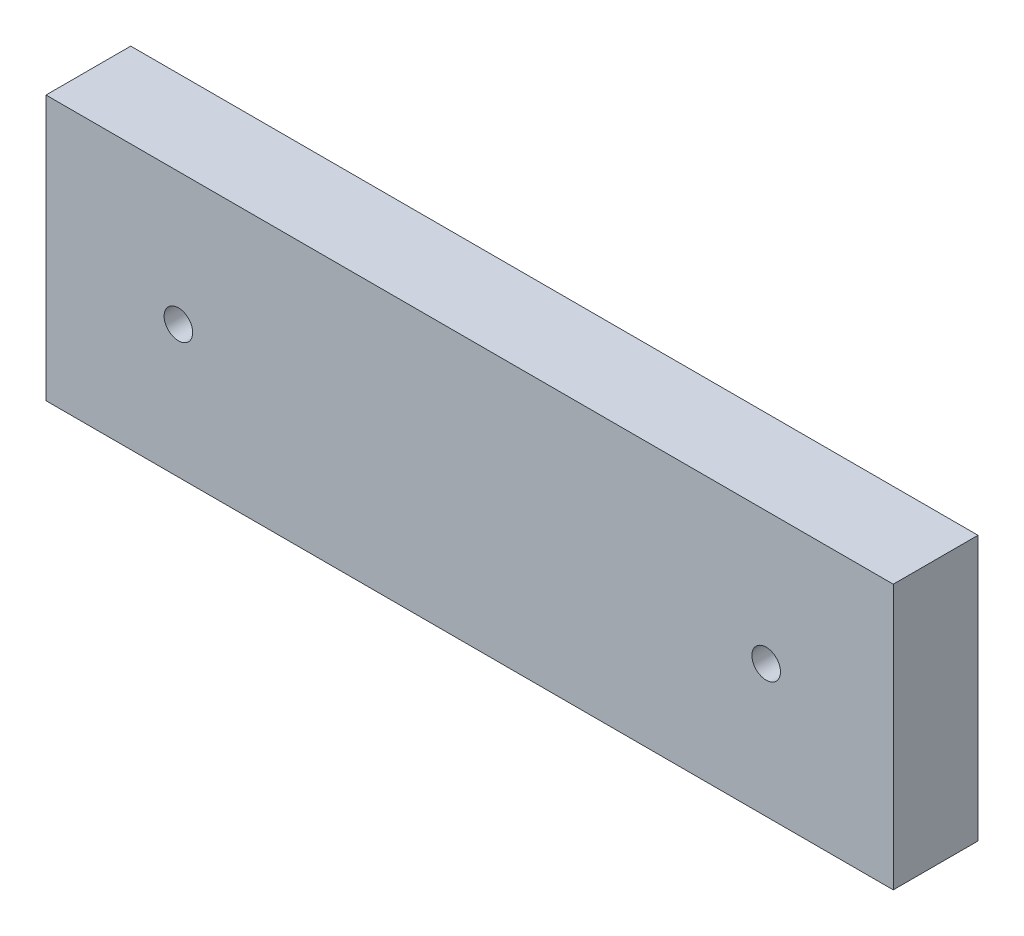
ISO-10303-21;
HEADER;
FILE_DESCRIPTION(('STEP AP214'),'2;1');
FILE_NAME('part.step','',(''),(''),'','','');
FILE_SCHEMA(('AUTOMOTIVE_DESIGN { 1 0 10303 214 1 1 1 1 }'));
ENDSEC;
DATA;
#1=APPLICATION_CONTEXT('core data for automotive mechanical design processes');
#2=APPLICATION_PROTOCOL_DEFINITION('international standard','automotive_design',2000,#1);
#3=PRODUCT_CONTEXT('',#1,'mechanical');
#4=PRODUCT('Part','Part','',(#3));
#5=PRODUCT_RELATED_PRODUCT_CATEGORY('part','',(#4));
#6=PRODUCT_DEFINITION_FORMATION('','',#4);
#7=PRODUCT_DEFINITION_CONTEXT('part definition',#1,'design');
#8=PRODUCT_DEFINITION('design','',#6,#7);
#9=PRODUCT_DEFINITION_SHAPE('','',#8);
#10=(LENGTH_UNIT() NAMED_UNIT(*) SI_UNIT(.MILLI.,.METRE.));
#11=(NAMED_UNIT(*) PLANE_ANGLE_UNIT() SI_UNIT($,.RADIAN.));
#12=(NAMED_UNIT(*) SI_UNIT($,.STERADIAN.) SOLID_ANGLE_UNIT());
#13=UNCERTAINTY_MEASURE_WITH_UNIT(LENGTH_MEASURE(1.E-05),#10,'distance_accuracy_value','');
#14=(GEOMETRIC_REPRESENTATION_CONTEXT(3) GLOBAL_UNCERTAINTY_ASSIGNED_CONTEXT((#13)) GLOBAL_UNIT_ASSIGNED_CONTEXT((#10,
#11,#12)) REPRESENTATION_CONTEXT('',''));
#15=CARTESIAN_POINT('',(0.,0.,0.));
#16=DIRECTION('',(0.,0.,1.));
#17=DIRECTION('',(1.,0.,0.));
#18=AXIS2_PLACEMENT_3D('',#15,#16,#17);
#19=CARTESIAN_POINT('',(68.,-14.15,-1.7));
#20=DIRECTION('',(0.,1.,0.));
#21=DIRECTION('',(-1.,0.,0.));
#22=AXIS2_PLACEMENT_3D('',#19,#20,#21);
#23=PLANE('',#22);
#24=DIRECTION('',(-1.,0.,0.));
#25=VECTOR('',#24,1.);
#26=CARTESIAN_POINT('',(68.,-14.15,-1.7));
#27=LINE('',#26,#25);
#28=CARTESIAN_POINT('',(39.1,-14.15,-1.7));
#29=VERTEX_POINT('',#28);
#30=CARTESIAN_POINT('',(12.5,-14.15,-1.7));
#31=VERTEX_POINT('',#30);
#32=EDGE_CURVE('E144',#29,#31,#27,.T.);
#33=ORIENTED_EDGE('',*,*,#32,.F.);
#34=DIRECTION('',(0.,0.,-1.));
#35=VECTOR('',#34,1.);
#36=CARTESIAN_POINT('',(39.1,-14.15,0.));
#37=LINE('',#36,#35);
#38=CARTESIAN_POINT('',(39.1,-14.15,0.));
#39=VERTEX_POINT('',#38);
#40=EDGE_CURVE('E128',#39,#29,#37,.T.);
#41=ORIENTED_EDGE('',*,*,#40,.F.);
#42=DIRECTION('',(-1.,0.,0.));
#43=VECTOR('',#42,1.);
#44=CARTESIAN_POINT('',(68.,-14.15,0.));
#45=LINE('',#44,#43);
#46=CARTESIAN_POINT('',(12.5,-14.15,0.));
#47=VERTEX_POINT('',#46);
#48=EDGE_CURVE('E174',#39,#47,#45,.T.);
#49=ORIENTED_EDGE('',*,*,#48,.T.);
#50=DIRECTION('',(0.,0.,1.));
#51=VECTOR('',#50,1.);
#52=CARTESIAN_POINT('',(12.5,-14.15,-1.7));
#53=LINE('',#52,#51);
#54=EDGE_CURVE('E149',#31,#47,#53,.T.);
#55=ORIENTED_EDGE('',*,*,#54,.F.);
#56=EDGE_LOOP('',(#33,#41,#49,#55));
#57=FACE_BOUND('',#56,.T.);
#58=ADVANCED_FACE('F39',(#57),#23,.F.);
#59=CARTESIAN_POINT('',(68.,-10.85,-1.7));
#60=DIRECTION('',(0.,-1.,0.));
#61=DIRECTION('',(1.,0.,0.));
#62=AXIS2_PLACEMENT_3D('',#59,#60,#61);
#63=PLANE('',#62);
#64=DIRECTION('',(1.,0.,0.));
#65=VECTOR('',#64,1.);
#66=CARTESIAN_POINT('',(68.,-10.85,0.));
#67=LINE('',#66,#65);
#68=CARTESIAN_POINT('',(12.5,-10.85,0.));
#69=VERTEX_POINT('',#68);
#70=CARTESIAN_POINT('',(39.1,-10.85,0.));
#71=VERTEX_POINT('',#70);
#72=EDGE_CURVE('E160',#69,#71,#67,.T.);
#73=ORIENTED_EDGE('',*,*,#72,.T.);
#74=DIRECTION('',(0.,0.,-1.));
#75=VECTOR('',#74,1.);
#76=CARTESIAN_POINT('',(39.1,-10.85,-1.7));
#77=LINE('',#76,#75);
#78=CARTESIAN_POINT('',(39.1,-10.85,-1.7));
#79=VERTEX_POINT('',#78);
#80=EDGE_CURVE('E175',#71,#79,#77,.T.);
#81=ORIENTED_EDGE('',*,*,#80,.T.);
#82=DIRECTION('',(1.,0.,0.));
#83=VECTOR('',#82,1.);
#84=CARTESIAN_POINT('',(68.,-10.85,-1.7));
#85=LINE('',#84,#83);
#86=CARTESIAN_POINT('',(12.5,-10.85,-1.7));
#87=VERTEX_POINT('',#86);
#88=EDGE_CURVE('E147',#87,#79,#85,.T.);
#89=ORIENTED_EDGE('',*,*,#88,.F.);
#90=DIRECTION('',(0.,0.,1.));
#91=VECTOR('',#90,1.);
#92=CARTESIAN_POINT('',(12.5,-10.85,-1.7));
#93=LINE('',#92,#91);
#94=EDGE_CURVE('E189',#87,#69,#93,.T.);
#95=ORIENTED_EDGE('',*,*,#94,.T.);
#96=EDGE_LOOP('',(#73,#81,#89,#95));
#97=FACE_BOUND('',#96,.T.);
#98=ADVANCED_FACE('F289',(#97),#63,.F.);
#99=CARTESIAN_POINT('',(68.,-12.5,-1.7));
#100=DIRECTION('',(0.,0.,-1.));
#101=DIRECTION('',(-1.,0.,0.));
#102=AXIS2_PLACEMENT_3D('',#99,#100,#101);
#103=PLANE('',#102);
#104=CARTESIAN_POINT('',(12.5,-12.5,-1.7));
#105=DIRECTION('',(0.,0.,-1.));
#106=DIRECTION('',(-1.,0.,0.));
#107=AXIS2_PLACEMENT_3D('',#104,#105,#106);
#108=CIRCLE('',#107,1.35);
#109=CARTESIAN_POINT('',(11.15,-12.5,-1.7));
#110=VERTEX_POINT('',#109);
#111=EDGE_CURVE('E280',#110,#110,#108,.T.);
#112=ORIENTED_EDGE('',*,*,#111,.F.);
#113=EDGE_LOOP('',(#112));
#114=FACE_BOUND('',#113,.T.);
#115=DIRECTION('',(0.,1.,0.));
#116=VECTOR('',#115,1.);
#117=CARTESIAN_POINT('',(39.1,-12.5,-1.7));
#118=LINE('',#117,#116);
#119=EDGE_CURVE('E11',#29,#79,#118,.T.);
#120=ORIENTED_EDGE('',*,*,#119,.F.);
#121=ORIENTED_EDGE('',*,*,#32,.T.);
#122=CARTESIAN_POINT('',(12.5,-12.5,-1.7));
#123=DIRECTION('',(0.,0.,-1.));
#124=DIRECTION('',(-1.,0.,0.));
#125=AXIS2_PLACEMENT_3D('',#122,#123,#124);
#126=CIRCLE('',#125,1.65);
#127=EDGE_CURVE('E158',#31,#87,#126,.T.);
#128=ORIENTED_EDGE('',*,*,#127,.T.);
#129=ORIENTED_EDGE('',*,*,#88,.T.);
#130=EDGE_LOOP('',(#120,#121,#128,#129));
#131=FACE_BOUND('',#130,.T.);
#132=ADVANCED_FACE('F143',(#114,#131),#103,.T.);
#133=CARTESIAN_POINT('',(0.,0.,0.));
#134=DIRECTION('',(0.,0.,1.));
#135=DIRECTION('',(1.,0.,0.));
#136=AXIS2_PLACEMENT_3D('',#133,#134,#135);
#137=PLANE('',#136);
#138=DIRECTION('',(0.,-1.,0.));
#139=VECTOR('',#138,1.);
#140=CARTESIAN_POINT('',(39.1,-7.15,0.));
#141=LINE('',#140,#139);
#142=EDGE_CURVE('E133',#71,#39,#141,.T.);
#143=ORIENTED_EDGE('',*,*,#142,.F.);
#144=ORIENTED_EDGE('',*,*,#72,.F.);
#145=CARTESIAN_POINT('',(12.5,-12.5,0.));
#146=DIRECTION('',(0.,0.,-1.));
#147=DIRECTION('',(-1.,0.,0.));
#148=AXIS2_PLACEMENT_3D('',#145,#146,#147);
#149=CIRCLE('',#148,1.65);
#150=EDGE_CURVE('E178',#47,#69,#149,.T.);
#151=ORIENTED_EDGE('',*,*,#150,.F.);
#152=ORIENTED_EDGE('',*,*,#48,.F.);
#153=EDGE_LOOP('',(#143,#144,#151,#152));
#154=FACE_BOUND('',#153,.T.);
#155=CARTESIAN_POINT('',(41.3,-10.85,0.));
#156=VERTEX_POINT('',#155);
#157=CARTESIAN_POINT('',(68.,-10.85,0.));
#158=VERTEX_POINT('',#157);
#159=EDGE_CURVE('E182',#156,#158,#67,.T.);
#160=ORIENTED_EDGE('',*,*,#159,.F.);
#161=DIRECTION('',(0.,-1.,0.));
#162=VECTOR('',#161,1.);
#163=CARTESIAN_POINT('',(41.3,-7.15,0.));
#164=LINE('',#163,#162);
#165=CARTESIAN_POINT('',(41.3,-14.15,0.));
#166=VERTEX_POINT('',#165);
#167=EDGE_CURVE('E248',#156,#166,#164,.T.);
#168=ORIENTED_EDGE('',*,*,#167,.T.);
#169=CARTESIAN_POINT('',(68.,-14.15,0.));
#170=VERTEX_POINT('',#169);
#171=EDGE_CURVE('E63',#170,#166,#45,.T.);
#172=ORIENTED_EDGE('',*,*,#171,.F.);
#173=CARTESIAN_POINT('',(68.,-12.5,0.));
#174=DIRECTION('',(0.,0.,-1.));
#175=DIRECTION('',(-1.,0.,0.));
#176=AXIS2_PLACEMENT_3D('',#173,#174,#175);
#177=CIRCLE('',#176,1.65);
#178=EDGE_CURVE('E170',#158,#170,#177,.T.);
#179=ORIENTED_EDGE('',*,*,#178,.F.);
#180=EDGE_LOOP('',(#160,#168,#172,#179));
#181=FACE_BOUND('',#180,.T.);
#182=DIRECTION('',(0.,-1.,0.));
#183=VECTOR('',#182,1.);
#184=CARTESIAN_POINT('',(0.,0.,0.));
#185=LINE('',#184,#183);
#186=CARTESIAN_POINT('',(0.,0.,0.));
#187=VERTEX_POINT('',#186);
#188=CARTESIAN_POINT('',(0.,-25.,0.));
#189=VERTEX_POINT('',#188);
#190=EDGE_CURVE('E198',#187,#189,#185,.T.);
#191=ORIENTED_EDGE('',*,*,#190,.F.);
#192=DIRECTION('',(-1.,0.,0.));
#193=VECTOR('',#192,1.);
#194=CARTESIAN_POINT('',(0.,0.,0.));
#195=LINE('',#194,#193);
#196=CARTESIAN_POINT('',(80.,0.,0.));
#197=VERTEX_POINT('',#196);
#198=EDGE_CURVE('E204',#197,#187,#195,.T.);
#199=ORIENTED_EDGE('',*,*,#198,.F.);
#200=DIRECTION('',(0.,1.,0.));
#201=VECTOR('',#200,1.);
#202=CARTESIAN_POINT('',(80.,0.,0.));
#203=LINE('',#202,#201);
#204=CARTESIAN_POINT('',(80.,-25.,0.));
#205=VERTEX_POINT('',#204);
#206=EDGE_CURVE('E220',#205,#197,#203,.T.);
#207=ORIENTED_EDGE('',*,*,#206,.F.);
#208=DIRECTION('',(1.,0.,0.));
#209=VECTOR('',#208,1.);
#210=CARTESIAN_POINT('',(0.,-25.,0.));
#211=LINE('',#210,#209);
#212=EDGE_CURVE('E217',#189,#205,#211,.T.);
#213=ORIENTED_EDGE('',*,*,#212,.F.);
#214=EDGE_LOOP('',(#191,#199,#207,#213));
#215=FACE_BOUND('',#214,.T.);
#216=ADVANCED_FACE('F257',(#154,#181,#215),#137,.F.);
#217=CARTESIAN_POINT('',(0.,0.,8.));
#218=DIRECTION('',(1.,0.,0.));
#219=DIRECTION('',(0.,1.,0.));
#220=AXIS2_PLACEMENT_3D('',#217,#218,#219);
#221=PLANE('',#220);
#222=ORIENTED_EDGE('',*,*,#190,.T.);
#223=DIRECTION('',(0.,0.,-1.));
#224=VECTOR('',#223,1.);
#225=CARTESIAN_POINT('',(0.,-25.,8.));
#226=LINE('',#225,#224);
#227=CARTESIAN_POINT('',(0.,-25.,8.));
#228=VERTEX_POINT('',#227);
#229=EDGE_CURVE('E236',#228,#189,#226,.T.);
#230=ORIENTED_EDGE('',*,*,#229,.F.);
#231=DIRECTION('',(0.,-1.,0.));
#232=VECTOR('',#231,1.);
#233=CARTESIAN_POINT('',(0.,0.,8.));
#234=LINE('',#233,#232);
#235=CARTESIAN_POINT('',(0.,0.,8.));
#236=VERTEX_POINT('',#235);
#237=EDGE_CURVE('E199',#236,#228,#234,.T.);
#238=ORIENTED_EDGE('',*,*,#237,.F.);
#239=DIRECTION('',(0.,0.,-1.));
#240=VECTOR('',#239,1.);
#241=CARTESIAN_POINT('',(0.,0.,8.));
#242=LINE('',#241,#240);
#243=EDGE_CURVE('E213',#236,#187,#242,.T.);
#244=ORIENTED_EDGE('',*,*,#243,.T.);
#245=EDGE_LOOP('',(#222,#230,#238,#244));
#246=FACE_BOUND('',#245,.T.);
#247=ADVANCED_FACE('F41',(#246),#221,.F.);
#248=CARTESIAN_POINT('',(0.,-25.,8.));
#249=DIRECTION('',(0.,1.,0.));
#250=DIRECTION('',(0.,0.,1.));
#251=AXIS2_PLACEMENT_3D('',#248,#249,#250);
#252=PLANE('',#251);
#253=ORIENTED_EDGE('',*,*,#212,.T.);
#254=DIRECTION('',(0.,0.,-1.));
#255=VECTOR('',#254,1.);
#256=CARTESIAN_POINT('',(80.,-25.,8.));
#257=LINE('',#256,#255);
#258=CARTESIAN_POINT('',(80.,-25.,8.));
#259=VERTEX_POINT('',#258);
#260=EDGE_CURVE('E232',#259,#205,#257,.T.);
#261=ORIENTED_EDGE('',*,*,#260,.F.);
#262=DIRECTION('',(1.,0.,0.));
#263=VECTOR('',#262,1.);
#264=CARTESIAN_POINT('',(0.,-25.,8.));
#265=LINE('',#264,#263);
#266=EDGE_CURVE('E203',#228,#259,#265,.T.);
#267=ORIENTED_EDGE('',*,*,#266,.F.);
#268=ORIENTED_EDGE('',*,*,#229,.T.);
#269=EDGE_LOOP('',(#253,#261,#267,#268));
#270=FACE_BOUND('',#269,.T.);
#271=ADVANCED_FACE('F329',(#270),#252,.F.);
#272=CARTESIAN_POINT('',(80.,0.,8.));
#273=DIRECTION('',(-1.,0.,0.));
#274=DIRECTION('',(0.,-1.,0.));
#275=AXIS2_PLACEMENT_3D('',#272,#273,#274);
#276=PLANE('',#275);
#277=ORIENTED_EDGE('',*,*,#206,.T.);
#278=DIRECTION('',(0.,0.,-1.));
#279=VECTOR('',#278,1.);
#280=CARTESIAN_POINT('',(80.,0.,8.));
#281=LINE('',#280,#279);
#282=CARTESIAN_POINT('',(80.,0.,8.));
#283=VERTEX_POINT('',#282);
#284=EDGE_CURVE('E228',#283,#197,#281,.T.);
#285=ORIENTED_EDGE('',*,*,#284,.F.);
#286=DIRECTION('',(0.,1.,0.));
#287=VECTOR('',#286,1.);
#288=CARTESIAN_POINT('',(80.,0.,8.));
#289=LINE('',#288,#287);
#290=EDGE_CURVE('E207',#259,#283,#289,.T.);
#291=ORIENTED_EDGE('',*,*,#290,.F.);
#292=ORIENTED_EDGE('',*,*,#260,.T.);
#293=EDGE_LOOP('',(#277,#285,#291,#292));
#294=FACE_BOUND('',#293,.T.);
#295=ADVANCED_FACE('F326',(#294),#276,.F.);
#296=CARTESIAN_POINT('',(0.,0.,8.));
#297=DIRECTION('',(0.,-1.,0.));
#298=DIRECTION('',(0.,0.,-1.));
#299=AXIS2_PLACEMENT_3D('',#296,#297,#298);
#300=PLANE('',#299);
#301=ORIENTED_EDGE('',*,*,#198,.T.);
#302=ORIENTED_EDGE('',*,*,#243,.F.);
#303=DIRECTION('',(-1.,0.,0.));
#304=VECTOR('',#303,1.);
#305=CARTESIAN_POINT('',(0.,0.,8.));
#306=LINE('',#305,#304);
#307=EDGE_CURVE('E210',#283,#236,#306,.T.);
#308=ORIENTED_EDGE('',*,*,#307,.F.);
#309=ORIENTED_EDGE('',*,*,#284,.T.);
#310=EDGE_LOOP('',(#301,#302,#308,#309));
#311=FACE_BOUND('',#310,.T.);
#312=ADVANCED_FACE('F320',(#311),#300,.F.);
#313=CARTESIAN_POINT('',(0.,0.,8.));
#314=DIRECTION('',(0.,0.,1.));
#315=DIRECTION('',(1.,0.,0.));
#316=AXIS2_PLACEMENT_3D('',#313,#314,#315);
#317=PLANE('',#316);
#318=CARTESIAN_POINT('',(68.,-12.5,8.));
#319=DIRECTION('',(0.,0.,-1.));
#320=DIRECTION('',(-1.,0.,0.));
#321=AXIS2_PLACEMENT_3D('',#318,#319,#320);
#322=CIRCLE('',#321,1.35000000000001);
#323=CARTESIAN_POINT('',(66.65,-12.5,8.));
#324=VERTEX_POINT('',#323);
#325=EDGE_CURVE('E139',#324,#324,#322,.T.);
#326=ORIENTED_EDGE('',*,*,#325,.T.);
#327=EDGE_LOOP('',(#326));
#328=FACE_BOUND('',#327,.T.);
#329=CARTESIAN_POINT('',(12.5,-12.5,8.));
#330=DIRECTION('',(0.,0.,-1.));
#331=DIRECTION('',(-1.,0.,0.));
#332=AXIS2_PLACEMENT_3D('',#329,#330,#331);
#333=CIRCLE('',#332,1.35);
#334=CARTESIAN_POINT('',(11.15,-12.5,8.));
#335=VERTEX_POINT('',#334);
#336=EDGE_CURVE('E276',#335,#335,#333,.T.);
#337=ORIENTED_EDGE('',*,*,#336,.T.);
#338=EDGE_LOOP('',(#337));
#339=FACE_BOUND('',#338,.T.);
#340=ORIENTED_EDGE('',*,*,#237,.T.);
#341=ORIENTED_EDGE('',*,*,#266,.T.);
#342=ORIENTED_EDGE('',*,*,#290,.T.);
#343=ORIENTED_EDGE('',*,*,#307,.T.);
#344=EDGE_LOOP('',(#340,#341,#342,#343));
#345=FACE_BOUND('',#344,.T.);
#346=ADVANCED_FACE('F316',(#328,#339,#345),#317,.T.);
#347=CARTESIAN_POINT('',(68.,-12.5,-1.7));
#348=DIRECTION('',(0.,0.,1.));
#349=DIRECTION('',(1.,0.,0.));
#350=AXIS2_PLACEMENT_3D('',#347,#348,#349);
#351=CYLINDRICAL_SURFACE('',#350,1.65);
#352=ORIENTED_EDGE('',*,*,#178,.T.);
#353=DIRECTION('',(0.,0.,1.));
#354=VECTOR('',#353,1.);
#355=CARTESIAN_POINT('',(68.,-14.15,-1.7));
#356=LINE('',#355,#354);
#357=CARTESIAN_POINT('',(68.,-14.15,-1.7));
#358=VERTEX_POINT('',#357);
#359=EDGE_CURVE('E195',#358,#170,#356,.T.);
#360=ORIENTED_EDGE('',*,*,#359,.F.);
#361=CARTESIAN_POINT('',(68.,-12.5,-1.7));
#362=DIRECTION('',(0.,0.,-1.));
#363=DIRECTION('',(-1.,0.,0.));
#364=AXIS2_PLACEMENT_3D('',#361,#362,#363);
#365=CIRCLE('',#364,1.65);
#366=CARTESIAN_POINT('',(68.,-10.85,-1.7));
#367=VERTEX_POINT('',#366);
#368=EDGE_CURVE('E153',#367,#358,#365,.T.);
#369=ORIENTED_EDGE('',*,*,#368,.F.);
#370=DIRECTION('',(0.,0.,1.));
#371=VECTOR('',#370,1.);
#372=CARTESIAN_POINT('',(68.,-10.85,-1.7));
#373=LINE('',#372,#371);
#374=EDGE_CURVE('E169',#367,#158,#373,.T.);
#375=ORIENTED_EDGE('',*,*,#374,.T.);
#376=EDGE_LOOP('',(#352,#360,#369,#375));
#377=FACE_BOUND('',#376,.T.);
#378=ADVANCED_FACE('F255',(#377),#351,.T.);
#379=ORIENTED_EDGE('',*,*,#171,.T.);
#380=DIRECTION('',(0.,0.,1.));
#381=VECTOR('',#380,1.);
#382=CARTESIAN_POINT('',(41.3,-14.15,0.));
#383=LINE('',#382,#381);
#384=CARTESIAN_POINT('',(41.3,-14.15,-1.7));
#385=VERTEX_POINT('',#384);
#386=EDGE_CURVE('E138',#385,#166,#383,.T.);
#387=ORIENTED_EDGE('',*,*,#386,.F.);
#388=EDGE_CURVE('E152',#358,#385,#27,.T.);
#389=ORIENTED_EDGE('',*,*,#388,.F.);
#390=ORIENTED_EDGE('',*,*,#359,.T.);
#391=EDGE_LOOP('',(#379,#387,#389,#390));
#392=FACE_BOUND('',#391,.T.);
#393=ADVANCED_FACE('F246',(#392),#23,.F.);
#394=CARTESIAN_POINT('',(12.5,-12.5,-1.7));
#395=DIRECTION('',(0.,0.,1.));
#396=DIRECTION('',(1.,0.,0.));
#397=AXIS2_PLACEMENT_3D('',#394,#395,#396);
#398=CYLINDRICAL_SURFACE('',#397,1.65);
#399=ORIENTED_EDGE('',*,*,#150,.T.);
#400=ORIENTED_EDGE('',*,*,#94,.F.);
#401=ORIENTED_EDGE('',*,*,#127,.F.);
#402=ORIENTED_EDGE('',*,*,#54,.T.);
#403=EDGE_LOOP('',(#399,#400,#401,#402));
#404=FACE_BOUND('',#403,.T.);
#405=ADVANCED_FACE('F310',(#404),#398,.T.);
#406=CARTESIAN_POINT('',(41.3,-10.85,-1.7));
#407=VERTEX_POINT('',#406);
#408=EDGE_CURVE('E166',#407,#367,#85,.T.);
#409=ORIENTED_EDGE('',*,*,#408,.F.);
#410=DIRECTION('',(0.,0.,1.));
#411=VECTOR('',#410,1.);
#412=CARTESIAN_POINT('',(41.3,-10.85,-1.7));
#413=LINE('',#412,#411);
#414=EDGE_CURVE('E55',#407,#156,#413,.T.);
#415=ORIENTED_EDGE('',*,*,#414,.T.);
#416=ORIENTED_EDGE('',*,*,#159,.T.);
#417=ORIENTED_EDGE('',*,*,#374,.F.);
#418=EDGE_LOOP('',(#409,#415,#416,#417));
#419=FACE_BOUND('',#418,.T.);
#420=ADVANCED_FACE('F299',(#419),#63,.F.);
#421=CARTESIAN_POINT('',(68.,-12.5,-1.7));
#422=DIRECTION('',(0.,0.,-1.));
#423=DIRECTION('',(-1.,0.,0.));
#424=AXIS2_PLACEMENT_3D('',#421,#422,#423);
#425=CIRCLE('',#424,1.35000000000001);
#426=CARTESIAN_POINT('',(66.65,-12.5,-1.7));
#427=VERTEX_POINT('',#426);
#428=EDGE_CURVE('E272',#427,#427,#425,.T.);
#429=ORIENTED_EDGE('',*,*,#428,.F.);
#430=EDGE_LOOP('',(#429));
#431=FACE_BOUND('',#430,.T.);
#432=DIRECTION('',(0.,-1.,0.));
#433=VECTOR('',#432,1.);
#434=CARTESIAN_POINT('',(41.3,-12.5,-1.7));
#435=LINE('',#434,#433);
#436=EDGE_CURVE('E48',#407,#385,#435,.T.);
#437=ORIENTED_EDGE('',*,*,#436,.F.);
#438=ORIENTED_EDGE('',*,*,#408,.T.);
#439=ORIENTED_EDGE('',*,*,#368,.T.);
#440=ORIENTED_EDGE('',*,*,#388,.T.);
#441=EDGE_LOOP('',(#437,#438,#439,#440));
#442=FACE_BOUND('',#441,.T.);
#443=ADVANCED_FACE('F250',(#431,#442),#103,.T.);
#444=CARTESIAN_POINT('',(39.1,-7.15,0.));
#445=DIRECTION('',(-1.,0.,0.));
#446=DIRECTION('',(0.,-1.,0.));
#447=AXIS2_PLACEMENT_3D('',#444,#445,#446);
#448=PLANE('',#447);
#449=ORIENTED_EDGE('',*,*,#142,.T.);
#450=ORIENTED_EDGE('',*,*,#40,.T.);
#451=ORIENTED_EDGE('',*,*,#119,.T.);
#452=ORIENTED_EDGE('',*,*,#80,.F.);
#453=EDGE_LOOP('',(#449,#450,#451,#452));
#454=FACE_BOUND('',#453,.T.);
#455=ADVANCED_FACE('F130',(#454),#448,.F.);
#456=CARTESIAN_POINT('',(41.3,-7.15,0.));
#457=DIRECTION('',(1.,0.,0.));
#458=DIRECTION('',(0.,1.,0.));
#459=AXIS2_PLACEMENT_3D('',#456,#457,#458);
#460=PLANE('',#459);
#461=ORIENTED_EDGE('',*,*,#436,.T.);
#462=ORIENTED_EDGE('',*,*,#386,.T.);
#463=ORIENTED_EDGE('',*,*,#167,.F.);
#464=ORIENTED_EDGE('',*,*,#414,.F.);
#465=EDGE_LOOP('',(#461,#462,#463,#464));
#466=FACE_BOUND('',#465,.T.);
#467=ADVANCED_FACE('F242',(#466),#460,.F.);
#468=CARTESIAN_POINT('',(68.,-12.5,8.));
#469=DIRECTION('',(0.,0.,-1.));
#470=DIRECTION('',(-1.,0.,0.));
#471=AXIS2_PLACEMENT_3D('',#468,#469,#470);
#472=CYLINDRICAL_SURFACE('',#471,1.35000000000001);
#473=ORIENTED_EDGE('',*,*,#325,.F.);
#474=EDGE_LOOP('',(#473));
#475=FACE_BOUND('',#474,.T.);
#476=ORIENTED_EDGE('',*,*,#428,.T.);
#477=EDGE_LOOP('',(#476));
#478=FACE_BOUND('',#477,.T.);
#479=ADVANCED_FACE('F388',(#475,#478),#472,.F.);
#480=CARTESIAN_POINT('',(12.5,-12.5,8.));
#481=DIRECTION('',(0.,0.,-1.));
#482=DIRECTION('',(-1.,0.,0.));
#483=AXIS2_PLACEMENT_3D('',#480,#481,#482);
#484=CYLINDRICAL_SURFACE('',#483,1.35);
#485=ORIENTED_EDGE('',*,*,#336,.F.);
#486=EDGE_LOOP('',(#485));
#487=FACE_BOUND('',#486,.T.);
#488=ORIENTED_EDGE('',*,*,#111,.T.);
#489=EDGE_LOOP('',(#488));
#490=FACE_BOUND('',#489,.T.);
#491=ADVANCED_FACE('F286',(#487,#490),#484,.F.);
#492=CLOSED_SHELL('',(#58,#98,#132,#216,#247,#271,#295,#312,#346,#378,#393,#405,#420,#443,#455,
#467,#479,#491));
#493=MANIFOLD_SOLID_BREP('B2',#492);
#494=ADVANCED_BREP_SHAPE_REPRESENTATION('',(#18,#493),#14);
#495=SHAPE_DEFINITION_REPRESENTATION(#9,#494);
ENDSEC;
END-ISO-10303-21;
